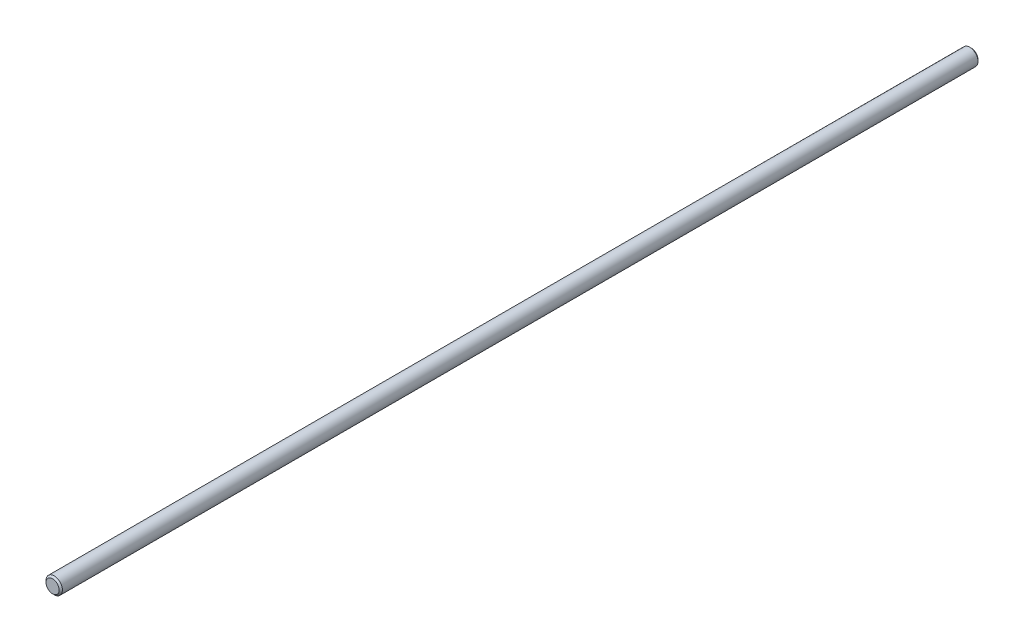
ISO-10303-21;
HEADER;
FILE_DESCRIPTION(('STEP AP214'),'2;1');
FILE_NAME('part.step','',(''),(''),'','','');
FILE_SCHEMA(('AUTOMOTIVE_DESIGN { 1 0 10303 214 1 1 1 1 }'));
ENDSEC;
DATA;
#1=APPLICATION_CONTEXT('core data for automotive mechanical design processes');
#2=APPLICATION_PROTOCOL_DEFINITION('international standard','automotive_design',2000,#1);
#3=PRODUCT_CONTEXT('',#1,'mechanical');
#4=PRODUCT('Part','Part','',(#3));
#5=PRODUCT_RELATED_PRODUCT_CATEGORY('part','',(#4));
#6=PRODUCT_DEFINITION_FORMATION('','',#4);
#7=PRODUCT_DEFINITION_CONTEXT('part definition',#1,'design');
#8=PRODUCT_DEFINITION('design','',#6,#7);
#9=PRODUCT_DEFINITION_SHAPE('','',#8);
#10=(LENGTH_UNIT() NAMED_UNIT(*) SI_UNIT(.MILLI.,.METRE.));
#11=(NAMED_UNIT(*) PLANE_ANGLE_UNIT() SI_UNIT($,.RADIAN.));
#12=(NAMED_UNIT(*) SI_UNIT($,.STERADIAN.) SOLID_ANGLE_UNIT());
#13=UNCERTAINTY_MEASURE_WITH_UNIT(LENGTH_MEASURE(1.E-05),#10,'distance_accuracy_value','');
#14=(GEOMETRIC_REPRESENTATION_CONTEXT(3) GLOBAL_UNCERTAINTY_ASSIGNED_CONTEXT((#13)) GLOBAL_UNIT_ASSIGNED_CONTEXT((#10,
#11,#12)) REPRESENTATION_CONTEXT('',''));
#15=CARTESIAN_POINT('',(0.,0.,0.));
#16=DIRECTION('',(0.,0.,1.));
#17=DIRECTION('',(1.,0.,0.));
#18=AXIS2_PLACEMENT_3D('',#15,#16,#17);
#19=CARTESIAN_POINT('',(0.,0.,140.));
#20=DIRECTION('',(0.,0.,-1.));
#21=DIRECTION('',(-1.,0.,0.));
#22=AXIS2_PLACEMENT_3D('',#19,#20,#21);
#23=CYLINDRICAL_SURFACE('',#22,2.5);
#24=CARTESIAN_POINT('',(0.,0.,-139.5));
#25=DIRECTION('',(0.,0.,1.));
#26=DIRECTION('',(1.,0.,0.));
#27=AXIS2_PLACEMENT_3D('',#24,#25,#26);
#28=CIRCLE('',#27,2.5);
#29=CARTESIAN_POINT('',(2.5,0.,-139.5));
#30=VERTEX_POINT('',#29);
#31=EDGE_CURVE('E44',#30,#30,#28,.T.);
#32=ORIENTED_EDGE('',*,*,#31,.T.);
#33=EDGE_LOOP('',(#32));
#34=FACE_BOUND('',#33,.T.);
#35=CARTESIAN_POINT('',(0.,0.,139.5));
#36=DIRECTION('',(0.,0.,1.));
#37=DIRECTION('',(1.,0.,0.));
#38=AXIS2_PLACEMENT_3D('',#35,#36,#37);
#39=CIRCLE('',#38,2.5);
#40=CARTESIAN_POINT('',(2.5,0.,139.5));
#41=VERTEX_POINT('',#40);
#42=EDGE_CURVE('E48',#41,#41,#39,.F.);
#43=ORIENTED_EDGE('',*,*,#42,.T.);
#44=EDGE_LOOP('',(#43));
#45=FACE_BOUND('',#44,.T.);
#46=ADVANCED_FACE('F32',(#34,#45),#23,.T.);
#47=CARTESIAN_POINT('',(0.,0.,140.));
#48=DIRECTION('',(0.,0.,1.));
#49=DIRECTION('',(1.,0.,0.));
#50=AXIS2_PLACEMENT_3D('',#47,#48,#49);
#51=PLANE('',#50);
#52=CARTESIAN_POINT('',(0.,0.,140.));
#53=DIRECTION('',(0.,0.,1.));
#54=DIRECTION('',(1.,0.,0.));
#55=AXIS2_PLACEMENT_3D('',#52,#53,#54);
#56=CIRCLE('',#55,2.00000000000003);
#57=CARTESIAN_POINT('',(2.00000000000003,0.,140.));
#58=VERTEX_POINT('',#57);
#59=EDGE_CURVE('E10',#58,#58,#56,.T.);
#60=ORIENTED_EDGE('',*,*,#59,.T.);
#61=EDGE_LOOP('',(#60));
#62=FACE_BOUND('',#61,.T.);
#63=ADVANCED_FACE('F64',(#62),#51,.T.);
#64=CARTESIAN_POINT('',(0.,0.,-140.));
#65=DIRECTION('',(0.,0.,1.));
#66=DIRECTION('',(1.,0.,0.));
#67=AXIS2_PLACEMENT_3D('',#64,#65,#66);
#68=PLANE('',#67);
#69=CARTESIAN_POINT('',(0.,0.,-140.));
#70=DIRECTION('',(0.,0.,1.));
#71=DIRECTION('',(1.,0.,0.));
#72=AXIS2_PLACEMENT_3D('',#69,#70,#71);
#73=CIRCLE('',#72,1.99999999999995);
#74=CARTESIAN_POINT('',(1.99999999999995,0.,-140.));
#75=VERTEX_POINT('',#74);
#76=EDGE_CURVE('E40',#75,#75,#73,.F.);
#77=ORIENTED_EDGE('',*,*,#76,.T.);
#78=EDGE_LOOP('',(#77));
#79=FACE_BOUND('',#78,.T.);
#80=ADVANCED_FACE('F61',(#79),#68,.F.);
#81=CARTESIAN_POINT('',(0.,0.,-139.5));
#82=DIRECTION('',(0.,0.,1.));
#83=DIRECTION('',(1.,0.,0.));
#84=AXIS2_PLACEMENT_3D('',#81,#82,#83);
#85=CONICAL_SURFACE('',#84,2.5,0.785398163397446);
#86=ORIENTED_EDGE('',*,*,#76,.F.);
#87=EDGE_LOOP('',(#86));
#88=FACE_BOUND('',#87,.T.);
#89=ORIENTED_EDGE('',*,*,#31,.F.);
#90=EDGE_LOOP('',(#89));
#91=FACE_BOUND('',#90,.T.);
#92=ADVANCED_FACE('F57',(#88,#91),#85,.T.);
#93=CARTESIAN_POINT('',(0.,0.,140.));
#94=DIRECTION('',(0.,0.,-1.));
#95=DIRECTION('',(-1.,0.,0.));
#96=AXIS2_PLACEMENT_3D('',#93,#94,#95);
#97=CONICAL_SURFACE('',#96,2.00000000000003,0.785398163397474);
#98=ORIENTED_EDGE('',*,*,#42,.F.);
#99=EDGE_LOOP('',(#98));
#100=FACE_BOUND('',#99,.T.);
#101=ORIENTED_EDGE('',*,*,#59,.F.);
#102=EDGE_LOOP('',(#101));
#103=FACE_BOUND('',#102,.T.);
#104=ADVANCED_FACE('F35',(#100,#103),#97,.T.);
#105=CLOSED_SHELL('',(#46,#63,#80,#92,#104));
#106=MANIFOLD_SOLID_BREP('B2',#105);
#107=ADVANCED_BREP_SHAPE_REPRESENTATION('',(#18,#106),#14);
#108=SHAPE_DEFINITION_REPRESENTATION(#9,#107);
ENDSEC;
END-ISO-10303-21;
